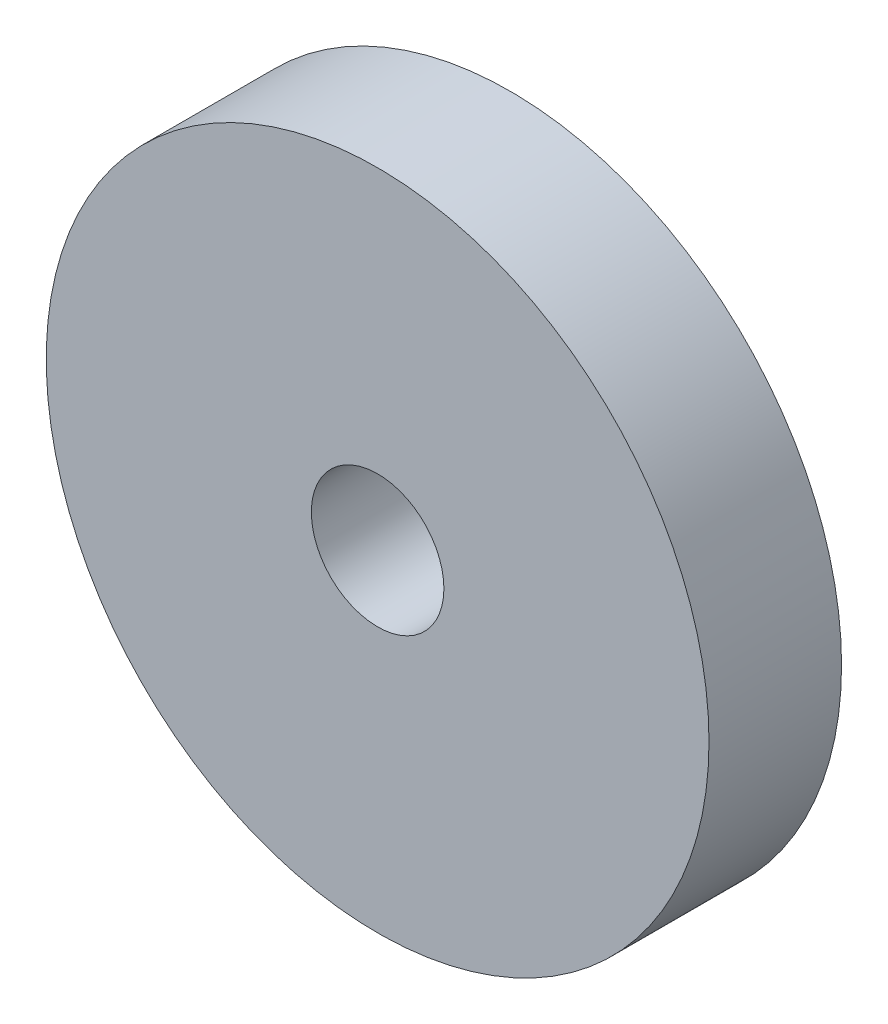
ISO-10303-21;
HEADER;
FILE_DESCRIPTION(('STEP AP214'),'2;1');
FILE_NAME('part.step','',(''),(''),'','','');
FILE_SCHEMA(('AUTOMOTIVE_DESIGN { 1 0 10303 214 1 1 1 1 }'));
ENDSEC;
DATA;
#1=APPLICATION_CONTEXT('core data for automotive mechanical design processes');
#2=APPLICATION_PROTOCOL_DEFINITION('international standard','automotive_design',2000,#1);
#3=PRODUCT_CONTEXT('',#1,'mechanical');
#4=PRODUCT('Part','Part','',(#3));
#5=PRODUCT_RELATED_PRODUCT_CATEGORY('part','',(#4));
#6=PRODUCT_DEFINITION_FORMATION('','',#4);
#7=PRODUCT_DEFINITION_CONTEXT('part definition',#1,'design');
#8=PRODUCT_DEFINITION('design','',#6,#7);
#9=PRODUCT_DEFINITION_SHAPE('','',#8);
#10=(LENGTH_UNIT() NAMED_UNIT(*) SI_UNIT(.MILLI.,.METRE.));
#11=(NAMED_UNIT(*) PLANE_ANGLE_UNIT() SI_UNIT($,.RADIAN.));
#12=(NAMED_UNIT(*) SI_UNIT($,.STERADIAN.) SOLID_ANGLE_UNIT());
#13=UNCERTAINTY_MEASURE_WITH_UNIT(LENGTH_MEASURE(1.E-05),#10,'distance_accuracy_value','');
#14=(GEOMETRIC_REPRESENTATION_CONTEXT(3) GLOBAL_UNCERTAINTY_ASSIGNED_CONTEXT((#13)) GLOBAL_UNIT_ASSIGNED_CONTEXT((#10,
#11,#12)) REPRESENTATION_CONTEXT('',''));
#15=CARTESIAN_POINT('',(0.,0.,0.));
#16=DIRECTION('',(0.,0.,1.));
#17=DIRECTION('',(1.,0.,0.));
#18=AXIS2_PLACEMENT_3D('',#15,#16,#17);
#19=CARTESIAN_POINT('',(0.,0.,6.));
#20=DIRECTION('',(0.,0.,1.));
#21=DIRECTION('',(1.,0.,0.));
#22=AXIS2_PLACEMENT_3D('',#19,#20,#21);
#23=PLANE('',#22);
#24=CARTESIAN_POINT('',(0.,0.,6.));
#25=DIRECTION('',(0.,0.,1.));
#26=DIRECTION('',(1.,0.,0.));
#27=AXIS2_PLACEMENT_3D('',#24,#25,#26);
#28=CIRCLE('',#27,15.);
#29=CARTESIAN_POINT('',(15.,0.,6.));
#30=VERTEX_POINT('',#29);
#31=EDGE_CURVE('E10',#30,#30,#28,.T.);
#32=ORIENTED_EDGE('',*,*,#31,.T.);
#33=EDGE_LOOP('',(#32));
#34=FACE_BOUND('',#33,.T.);
#35=CARTESIAN_POINT('',(0.,0.,6.));
#36=DIRECTION('',(0.,0.,1.));
#37=DIRECTION('',(1.,0.,0.));
#38=AXIS2_PLACEMENT_3D('',#35,#36,#37);
#39=CIRCLE('',#38,3.);
#40=CARTESIAN_POINT('',(3.,0.,6.));
#41=VERTEX_POINT('',#40);
#42=EDGE_CURVE('E46',#41,#41,#39,.T.);
#43=ORIENTED_EDGE('',*,*,#42,.F.);
#44=EDGE_LOOP('',(#43));
#45=FACE_BOUND('',#44,.T.);
#46=ADVANCED_FACE('F35',(#34,#45),#23,.T.);
#47=CARTESIAN_POINT('',(0.,0.,0.));
#48=DIRECTION('',(0.,0.,1.));
#49=DIRECTION('',(1.,0.,0.));
#50=AXIS2_PLACEMENT_3D('',#47,#48,#49);
#51=PLANE('',#50);
#52=CARTESIAN_POINT('',(0.,0.,0.));
#53=DIRECTION('',(0.,0.,1.));
#54=DIRECTION('',(1.,0.,0.));
#55=AXIS2_PLACEMENT_3D('',#52,#53,#54);
#56=CIRCLE('',#55,15.);
#57=CARTESIAN_POINT('',(15.,0.,0.));
#58=VERTEX_POINT('',#57);
#59=EDGE_CURVE('E39',#58,#58,#56,.T.);
#60=ORIENTED_EDGE('',*,*,#59,.F.);
#61=EDGE_LOOP('',(#60));
#62=FACE_BOUND('',#61,.T.);
#63=CARTESIAN_POINT('',(0.,0.,0.));
#64=DIRECTION('',(0.,0.,1.));
#65=DIRECTION('',(1.,0.,0.));
#66=AXIS2_PLACEMENT_3D('',#63,#64,#65);
#67=CIRCLE('',#66,3.);
#68=CARTESIAN_POINT('',(3.,0.,0.));
#69=VERTEX_POINT('',#68);
#70=EDGE_CURVE('E48',#69,#69,#67,.T.);
#71=ORIENTED_EDGE('',*,*,#70,.T.);
#72=EDGE_LOOP('',(#71));
#73=FACE_BOUND('',#72,.T.);
#74=ADVANCED_FACE('F58',(#62,#73),#51,.F.);
#75=CARTESIAN_POINT('',(0.,0.,6.));
#76=DIRECTION('',(0.,0.,-1.));
#77=DIRECTION('',(-1.,0.,0.));
#78=AXIS2_PLACEMENT_3D('',#75,#76,#77);
#79=CYLINDRICAL_SURFACE('',#78,15.);
#80=ORIENTED_EDGE('',*,*,#31,.F.);
#81=EDGE_LOOP('',(#80));
#82=FACE_BOUND('',#81,.T.);
#83=ORIENTED_EDGE('',*,*,#59,.T.);
#84=EDGE_LOOP('',(#83));
#85=FACE_BOUND('',#84,.T.);
#86=ADVANCED_FACE('F37',(#82,#85),#79,.T.);
#87=CARTESIAN_POINT('',(0.,0.,6.));
#88=DIRECTION('',(0.,0.,-1.));
#89=DIRECTION('',(-1.,0.,0.));
#90=AXIS2_PLACEMENT_3D('',#87,#88,#89);
#91=CYLINDRICAL_SURFACE('',#90,3.);
#92=ORIENTED_EDGE('',*,*,#42,.T.);
#93=EDGE_LOOP('',(#92));
#94=FACE_BOUND('',#93,.T.);
#95=ORIENTED_EDGE('',*,*,#70,.F.);
#96=EDGE_LOOP('',(#95));
#97=FACE_BOUND('',#96,.T.);
#98=ADVANCED_FACE('F54',(#94,#97),#91,.F.);
#99=CLOSED_SHELL('',(#46,#74,#86,#98));
#100=MANIFOLD_SOLID_BREP('B2',#99);
#101=ADVANCED_BREP_SHAPE_REPRESENTATION('',(#18,#100),#14);
#102=SHAPE_DEFINITION_REPRESENTATION(#9,#101);
ENDSEC;
END-ISO-10303-21;
